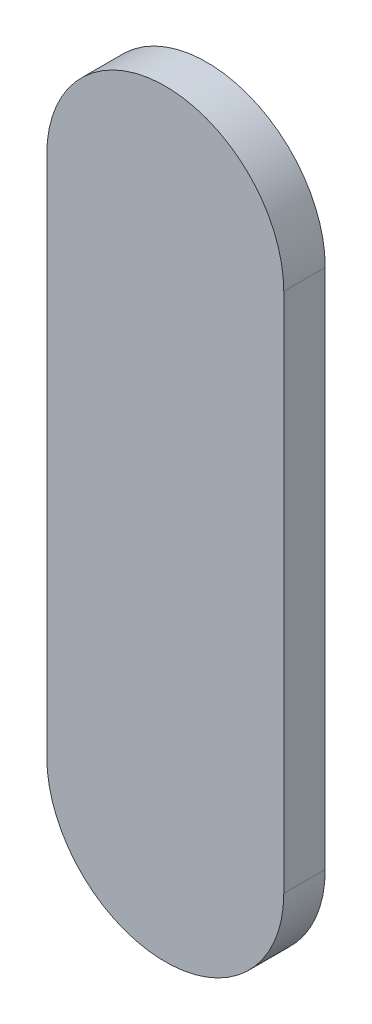
ISO-10303-21;
HEADER;
FILE_DESCRIPTION(('STEP AP214'),'2;1');
FILE_NAME('part.step','',(''),(''),'','','');
FILE_SCHEMA(('AUTOMOTIVE_DESIGN { 1 0 10303 214 1 1 1 1 }'));
ENDSEC;
DATA;
#1=APPLICATION_CONTEXT('core data for automotive mechanical design processes');
#2=APPLICATION_PROTOCOL_DEFINITION('international standard','automotive_design',2000,#1);
#3=PRODUCT_CONTEXT('',#1,'mechanical');
#4=PRODUCT('Part','Part','',(#3));
#5=PRODUCT_RELATED_PRODUCT_CATEGORY('part','',(#4));
#6=PRODUCT_DEFINITION_FORMATION('','',#4);
#7=PRODUCT_DEFINITION_CONTEXT('part definition',#1,'design');
#8=PRODUCT_DEFINITION('design','',#6,#7);
#9=PRODUCT_DEFINITION_SHAPE('','',#8);
#10=(LENGTH_UNIT() NAMED_UNIT(*) SI_UNIT(.MILLI.,.METRE.));
#11=(NAMED_UNIT(*) PLANE_ANGLE_UNIT() SI_UNIT($,.RADIAN.));
#12=(NAMED_UNIT(*) SI_UNIT($,.STERADIAN.) SOLID_ANGLE_UNIT());
#13=UNCERTAINTY_MEASURE_WITH_UNIT(LENGTH_MEASURE(1.E-05),#10,'distance_accuracy_value','');
#14=(GEOMETRIC_REPRESENTATION_CONTEXT(3) GLOBAL_UNCERTAINTY_ASSIGNED_CONTEXT((#13)) GLOBAL_UNIT_ASSIGNED_CONTEXT((#10,
#11,#12)) REPRESENTATION_CONTEXT('',''));
#15=CARTESIAN_POINT('',(0.,0.,0.));
#16=DIRECTION('',(0.,0.,1.));
#17=DIRECTION('',(1.,0.,0.));
#18=AXIS2_PLACEMENT_3D('',#15,#16,#17);
#19=CARTESIAN_POINT('',(80.04,-109.25,1.635));
#20=DIRECTION('',(0.,0.,1.));
#21=DIRECTION('',(1.,0.,0.));
#22=AXIS2_PLACEMENT_3D('',#19,#20,#21);
#23=PLANE('',#22);
#24=DIRECTION('',(0.,-1.,0.));
#25=VECTOR('',#24,1.);
#26=CARTESIAN_POINT('',(80.04,-109.25,1.635));
#27=LINE('',#26,#25);
#28=CARTESIAN_POINT('',(80.04,-109.25,1.635));
#29=VERTEX_POINT('',#28);
#30=CARTESIAN_POINT('',(80.04,-109.69,1.635));
#31=VERTEX_POINT('',#30);
#32=EDGE_CURVE('E81',#29,#31,#27,.T.);
#33=ORIENTED_EDGE('',*,*,#32,.T.);
#34=CARTESIAN_POINT('',(80.14,-109.69,1.635));
#35=DIRECTION('',(0.,0.,1.));
#36=DIRECTION('',(-1.,2.842170943041E-13,0.));
#37=AXIS2_PLACEMENT_3D('',#34,#35,#36);
#38=CIRCLE('',#37,0.09999999999999);
#39=CARTESIAN_POINT('',(80.24,-109.69,1.635));
#40=VERTEX_POINT('',#39);
#41=EDGE_CURVE('E99',#31,#40,#38,.T.);
#42=ORIENTED_EDGE('',*,*,#41,.T.);
#43=DIRECTION('',(0.,1.,0.));
#44=VECTOR('',#43,1.);
#45=CARTESIAN_POINT('',(80.24,-109.69,1.635));
#46=LINE('',#45,#44);
#47=CARTESIAN_POINT('',(80.24,-109.25,1.635));
#48=VERTEX_POINT('',#47);
#49=EDGE_CURVE('E74',#40,#48,#46,.T.);
#50=ORIENTED_EDGE('',*,*,#49,.T.);
#51=CARTESIAN_POINT('',(80.14,-109.25,1.635));
#52=DIRECTION('',(0.,0.,1.));
#53=DIRECTION('',(1.,0.,0.));
#54=AXIS2_PLACEMENT_3D('',#51,#52,#53);
#55=CIRCLE('',#54,0.09999999999999);
#56=EDGE_CURVE('E11',#48,#29,#55,.T.);
#57=ORIENTED_EDGE('',*,*,#56,.T.);
#58=EDGE_LOOP('',(#33,#42,#50,#57));
#59=FACE_BOUND('',#58,.T.);
#60=ADVANCED_FACE('F17',(#59),#23,.T.);
#61=CARTESIAN_POINT('',(80.04,-109.25,1.6));
#62=DIRECTION('',(0.,0.,1.));
#63=DIRECTION('',(1.,0.,0.));
#64=AXIS2_PLACEMENT_3D('',#61,#62,#63);
#65=PLANE('',#64);
#66=CARTESIAN_POINT('',(80.14,-109.25,1.6));
#67=DIRECTION('',(0.,0.,1.));
#68=DIRECTION('',(1.,0.,0.));
#69=AXIS2_PLACEMENT_3D('',#66,#67,#68);
#70=CIRCLE('',#69,0.09999999999999);
#71=CARTESIAN_POINT('',(80.24,-109.25,1.6));
#72=VERTEX_POINT('',#71);
#73=CARTESIAN_POINT('',(80.04,-109.25,1.6));
#74=VERTEX_POINT('',#73);
#75=EDGE_CURVE('E25',#72,#74,#70,.T.);
#76=ORIENTED_EDGE('',*,*,#75,.F.);
#77=DIRECTION('',(0.,1.,0.));
#78=VECTOR('',#77,1.);
#79=CARTESIAN_POINT('',(80.24,-109.69,1.6));
#80=LINE('',#79,#78);
#81=CARTESIAN_POINT('',(80.24,-109.69,1.6));
#82=VERTEX_POINT('',#81);
#83=EDGE_CURVE('E97',#82,#72,#80,.T.);
#84=ORIENTED_EDGE('',*,*,#83,.F.);
#85=CARTESIAN_POINT('',(80.14,-109.69,1.6));
#86=DIRECTION('',(0.,0.,1.));
#87=DIRECTION('',(-1.,2.842170943041E-13,0.));
#88=AXIS2_PLACEMENT_3D('',#85,#86,#87);
#89=CIRCLE('',#88,0.09999999999999);
#90=CARTESIAN_POINT('',(80.04,-109.69,1.6));
#91=VERTEX_POINT('',#90);
#92=EDGE_CURVE('E83',#91,#82,#89,.T.);
#93=ORIENTED_EDGE('',*,*,#92,.F.);
#94=DIRECTION('',(0.,-1.,0.));
#95=VECTOR('',#94,1.);
#96=CARTESIAN_POINT('',(80.04,-109.25,1.6));
#97=LINE('',#96,#95);
#98=EDGE_CURVE('E79',#74,#91,#97,.T.);
#99=ORIENTED_EDGE('',*,*,#98,.F.);
#100=EDGE_LOOP('',(#76,#84,#93,#99));
#101=FACE_BOUND('',#100,.T.);
#102=ADVANCED_FACE('F85',(#101),#65,.F.);
#103=CARTESIAN_POINT('',(80.14,-109.25,1.6));
#104=DIRECTION('',(0.,0.,-1.));
#105=DIRECTION('',(1.,0.,0.));
#106=AXIS2_PLACEMENT_3D('',#103,#104,#105);
#107=CYLINDRICAL_SURFACE('',#106,0.09999999999999);
#108=ORIENTED_EDGE('',*,*,#75,.T.);
#109=DIRECTION('',(0.,0.,1.));
#110=VECTOR('',#109,1.);
#111=CARTESIAN_POINT('',(80.04,-109.25,1.6));
#112=LINE('',#111,#110);
#113=EDGE_CURVE('E68',#74,#29,#112,.T.);
#114=ORIENTED_EDGE('',*,*,#113,.T.);
#115=ORIENTED_EDGE('',*,*,#56,.F.);
#116=DIRECTION('',(0.,0.,1.));
#117=VECTOR('',#116,1.);
#118=CARTESIAN_POINT('',(80.24,-109.25,1.6));
#119=LINE('',#118,#117);
#120=EDGE_CURVE('E71',#72,#48,#119,.T.);
#121=ORIENTED_EDGE('',*,*,#120,.F.);
#122=EDGE_LOOP('',(#108,#114,#115,#121));
#123=FACE_BOUND('',#122,.T.);
#124=ADVANCED_FACE('F67',(#123),#107,.T.);
#125=CARTESIAN_POINT('',(80.24,-109.69,1.6));
#126=DIRECTION('',(-1.,0.,0.));
#127=DIRECTION('',(0.,0.,1.));
#128=AXIS2_PLACEMENT_3D('',#125,#126,#127);
#129=PLANE('',#128);
#130=ORIENTED_EDGE('',*,*,#83,.T.);
#131=ORIENTED_EDGE('',*,*,#120,.T.);
#132=ORIENTED_EDGE('',*,*,#49,.F.);
#133=DIRECTION('',(0.,0.,1.));
#134=VECTOR('',#133,1.);
#135=CARTESIAN_POINT('',(80.24,-109.69,1.6));
#136=LINE('',#135,#134);
#137=EDGE_CURVE('E105',#82,#40,#136,.T.);
#138=ORIENTED_EDGE('',*,*,#137,.F.);
#139=EDGE_LOOP('',(#130,#131,#132,#138));
#140=FACE_BOUND('',#139,.T.);
#141=ADVANCED_FACE('F120',(#140),#129,.F.);
#142=CARTESIAN_POINT('',(80.14,-109.69,1.6));
#143=DIRECTION('',(0.,0.,-1.));
#144=DIRECTION('',(-1.,2.842170943041E-13,0.));
#145=AXIS2_PLACEMENT_3D('',#142,#143,#144);
#146=CYLINDRICAL_SURFACE('',#145,0.09999999999999);
#147=ORIENTED_EDGE('',*,*,#92,.T.);
#148=ORIENTED_EDGE('',*,*,#137,.T.);
#149=ORIENTED_EDGE('',*,*,#41,.F.);
#150=DIRECTION('',(0.,0.,1.));
#151=VECTOR('',#150,1.);
#152=CARTESIAN_POINT('',(80.04,-109.69,1.6));
#153=LINE('',#152,#151);
#154=EDGE_CURVE('E89',#91,#31,#153,.T.);
#155=ORIENTED_EDGE('',*,*,#154,.F.);
#156=EDGE_LOOP('',(#147,#148,#149,#155));
#157=FACE_BOUND('',#156,.T.);
#158=ADVANCED_FACE('F122',(#157),#146,.T.);
#159=CARTESIAN_POINT('',(80.04,-109.25,1.6));
#160=DIRECTION('',(1.,0.,0.));
#161=DIRECTION('',(0.,1.,0.));
#162=AXIS2_PLACEMENT_3D('',#159,#160,#161);
#163=PLANE('',#162);
#164=ORIENTED_EDGE('',*,*,#98,.T.);
#165=ORIENTED_EDGE('',*,*,#154,.T.);
#166=ORIENTED_EDGE('',*,*,#32,.F.);
#167=ORIENTED_EDGE('',*,*,#113,.F.);
#168=EDGE_LOOP('',(#164,#165,#166,#167));
#169=FACE_BOUND('',#168,.T.);
#170=ADVANCED_FACE('F77',(#169),#163,.F.);
#171=CLOSED_SHELL('',(#60,#102,#124,#141,#158,#170));
#172=MANIFOLD_SOLID_BREP('B1',#171);
#173=ADVANCED_BREP_SHAPE_REPRESENTATION('',(#18,#172),#14);
#174=SHAPE_DEFINITION_REPRESENTATION(#9,#173);
ENDSEC;
END-ISO-10303-21;
